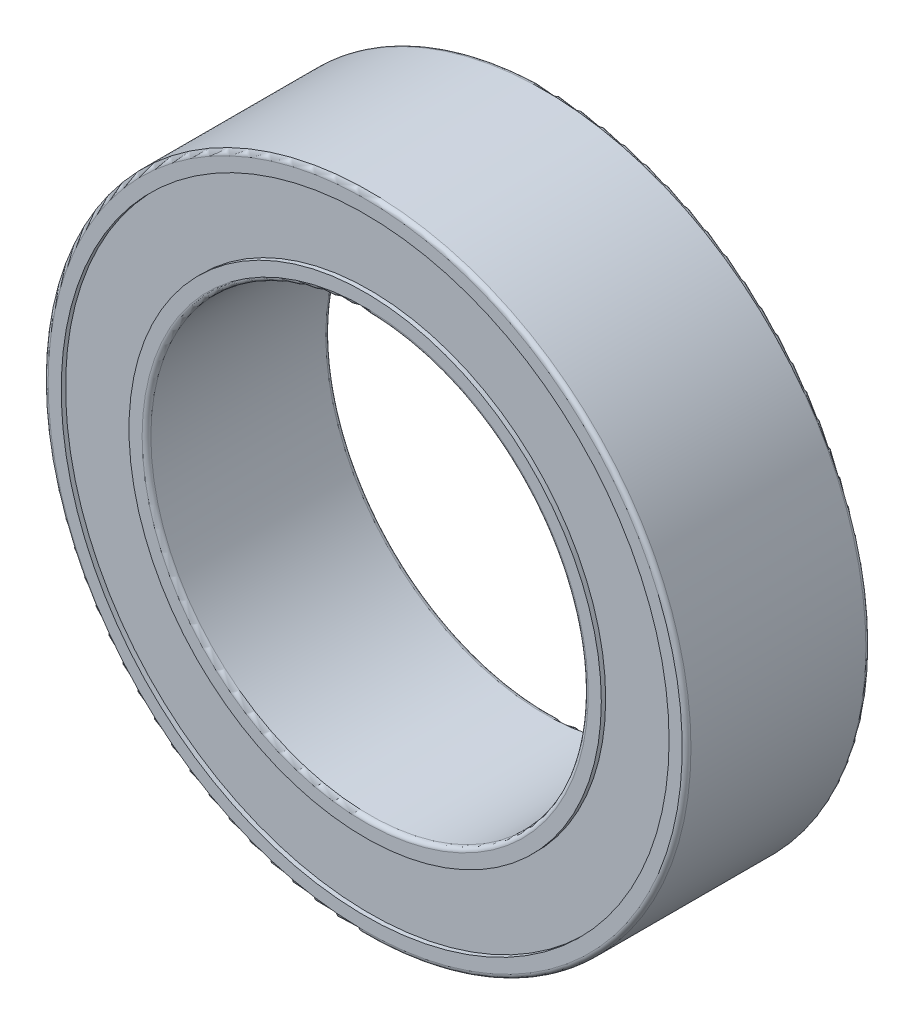
ISO-10303-21;
HEADER;
FILE_DESCRIPTION(('STEP AP214'),'2;1');
FILE_NAME('part.step','',(''),(''),'','','');
FILE_SCHEMA(('AUTOMOTIVE_DESIGN { 1 0 10303 214 1 1 1 1 }'));
ENDSEC;
DATA;
#1=APPLICATION_CONTEXT('core data for automotive mechanical design processes');
#2=APPLICATION_PROTOCOL_DEFINITION('international standard','automotive_design',2000,#1);
#3=PRODUCT_CONTEXT('',#1,'mechanical');
#4=PRODUCT('Part','Part','',(#3));
#5=PRODUCT_RELATED_PRODUCT_CATEGORY('part','',(#4));
#6=PRODUCT_DEFINITION_FORMATION('','',#4);
#7=PRODUCT_DEFINITION_CONTEXT('part definition',#1,'design');
#8=PRODUCT_DEFINITION('design','',#6,#7);
#9=PRODUCT_DEFINITION_SHAPE('','',#8);
#10=(LENGTH_UNIT() NAMED_UNIT(*) SI_UNIT(.MILLI.,.METRE.));
#11=(NAMED_UNIT(*) PLANE_ANGLE_UNIT() SI_UNIT($,.RADIAN.));
#12=(NAMED_UNIT(*) SI_UNIT($,.STERADIAN.) SOLID_ANGLE_UNIT());
#13=UNCERTAINTY_MEASURE_WITH_UNIT(LENGTH_MEASURE(1.E-05),#10,'distance_accuracy_value','');
#14=(GEOMETRIC_REPRESENTATION_CONTEXT(3) GLOBAL_UNCERTAINTY_ASSIGNED_CONTEXT((#13)) GLOBAL_UNIT_ASSIGNED_CONTEXT((#10,
#11,#12)) REPRESENTATION_CONTEXT('',''));
#15=CARTESIAN_POINT('',(0.,0.,0.));
#16=DIRECTION('',(0.,0.,1.));
#17=DIRECTION('',(1.,0.,0.));
#18=AXIS2_PLACEMENT_3D('',#15,#16,#17);
#19=CARTESIAN_POINT('',(0.,0.,14.88));
#20=DIRECTION('',(0.,0.,1.));
#21=DIRECTION('',(1.,0.,0.));
#22=AXIS2_PLACEMENT_3D('',#19,#20,#21);
#23=CYLINDRICAL_SURFACE('',#22,5.);
#24=CARTESIAN_POINT('',(0.,0.,2.));
#25=DIRECTION('',(0.,0.,-1.));
#26=DIRECTION('',(-1.,0.,0.));
#27=AXIS2_PLACEMENT_3D('',#24,#25,#26);
#28=CIRCLE('',#27,5.);
#29=CARTESIAN_POINT('',(-5.,0.,2.));
#30=VERTEX_POINT('',#29);
#31=EDGE_CURVE('E62',#30,#30,#28,.F.);
#32=ORIENTED_EDGE('',*,*,#31,.T.);
#33=EDGE_LOOP('',(#32));
#34=FACE_BOUND('',#33,.T.);
#35=CARTESIAN_POINT('',(0.,0.,-2.));
#36=DIRECTION('',(0.,0.,1.));
#37=DIRECTION('',(1.,0.,0.));
#38=AXIS2_PLACEMENT_3D('',#35,#36,#37);
#39=CIRCLE('',#38,5.);
#40=CARTESIAN_POINT('',(5.,0.,-2.));
#41=VERTEX_POINT('',#40);
#42=EDGE_CURVE('E65',#41,#41,#39,.F.);
#43=ORIENTED_EDGE('',*,*,#42,.T.);
#44=EDGE_LOOP('',(#43));
#45=FACE_BOUND('',#44,.T.);
#46=ADVANCED_FACE('F36',(#34,#45),#23,.F.);
#47=CARTESIAN_POINT('',(0.,5.,-2.1));
#48=DIRECTION('',(0.,0.,1.));
#49=DIRECTION('',(1.,0.,0.));
#50=AXIS2_PLACEMENT_3D('',#47,#48,#49);
#51=PLANE('',#50);
#52=CARTESIAN_POINT('',(0.,0.,-2.1));
#53=DIRECTION('',(0.,0.,1.));
#54=DIRECTION('',(1.,0.,0.));
#55=AXIS2_PLACEMENT_3D('',#52,#53,#54);
#56=CIRCLE('',#55,5.1);
#57=CARTESIAN_POINT('',(5.1,0.,-2.1));
#58=VERTEX_POINT('',#57);
#59=EDGE_CURVE('E56',#58,#58,#56,.T.);
#60=ORIENTED_EDGE('',*,*,#59,.T.);
#61=EDGE_LOOP('',(#60));
#62=FACE_BOUND('',#61,.T.);
#63=CARTESIAN_POINT('',(0.,0.,-2.1));
#64=DIRECTION('',(0.,0.,1.));
#65=DIRECTION('',(1.,0.,0.));
#66=AXIS2_PLACEMENT_3D('',#63,#64,#65);
#67=CIRCLE('',#66,5.4);
#68=CARTESIAN_POINT('',(5.4,0.,-2.1));
#69=VERTEX_POINT('',#68);
#70=EDGE_CURVE('E68',#69,#69,#67,.T.);
#71=ORIENTED_EDGE('',*,*,#70,.F.);
#72=EDGE_LOOP('',(#71));
#73=FACE_BOUND('',#72,.T.);
#74=ADVANCED_FACE('F124',(#62,#73),#51,.F.);
#75=CARTESIAN_POINT('',(0.,0.,14.88));
#76=DIRECTION('',(0.,0.,1.));
#77=DIRECTION('',(1.,0.,0.));
#78=AXIS2_PLACEMENT_3D('',#75,#76,#77);
#79=CYLINDRICAL_SURFACE('',#78,5.4);
#80=CARTESIAN_POINT('',(0.,0.,-2.));
#81=DIRECTION('',(0.,0.,1.));
#82=DIRECTION('',(1.,0.,0.));
#83=AXIS2_PLACEMENT_3D('',#80,#81,#82);
#84=CIRCLE('',#83,5.4);
#85=CARTESIAN_POINT('',(5.4,0.,-2.));
#86=VERTEX_POINT('',#85);
#87=EDGE_CURVE('E71',#86,#86,#84,.T.);
#88=ORIENTED_EDGE('',*,*,#87,.F.);
#89=EDGE_LOOP('',(#88));
#90=FACE_BOUND('',#89,.T.);
#91=ORIENTED_EDGE('',*,*,#70,.T.);
#92=EDGE_LOOP('',(#91));
#93=FACE_BOUND('',#92,.T.);
#94=ADVANCED_FACE('F130',(#90,#93),#79,.T.);
#95=CARTESIAN_POINT('',(0.,5.4,-2.));
#96=DIRECTION('',(0.,0.,1.));
#97=DIRECTION('',(1.,0.,0.));
#98=AXIS2_PLACEMENT_3D('',#95,#96,#97);
#99=PLANE('',#98);
#100=CARTESIAN_POINT('',(0.,0.,-2.));
#101=DIRECTION('',(0.,0.,1.));
#102=DIRECTION('',(1.,0.,0.));
#103=AXIS2_PLACEMENT_3D('',#100,#101,#102);
#104=CIRCLE('',#103,6.95);
#105=CARTESIAN_POINT('',(6.95,0.,-2.));
#106=VERTEX_POINT('',#105);
#107=EDGE_CURVE('E74',#106,#106,#104,.T.);
#108=ORIENTED_EDGE('',*,*,#107,.F.);
#109=EDGE_LOOP('',(#108));
#110=FACE_BOUND('',#109,.T.);
#111=ORIENTED_EDGE('',*,*,#87,.T.);
#112=EDGE_LOOP('',(#111));
#113=FACE_BOUND('',#112,.T.);
#114=ADVANCED_FACE('F255',(#110,#113),#99,.F.);
#115=CARTESIAN_POINT('',(0.,0.,14.88));
#116=DIRECTION('',(0.,0.,1.));
#117=DIRECTION('',(1.,0.,0.));
#118=AXIS2_PLACEMENT_3D('',#115,#116,#117);
#119=CYLINDRICAL_SURFACE('',#118,6.95);
#120=CARTESIAN_POINT('',(0.,0.,-2.1));
#121=DIRECTION('',(0.,0.,1.));
#122=DIRECTION('',(1.,0.,0.));
#123=AXIS2_PLACEMENT_3D('',#120,#121,#122);
#124=CIRCLE('',#123,6.95);
#125=CARTESIAN_POINT('',(6.95,0.,-2.1));
#126=VERTEX_POINT('',#125);
#127=EDGE_CURVE('E77',#126,#126,#124,.T.);
#128=ORIENTED_EDGE('',*,*,#127,.F.);
#129=EDGE_LOOP('',(#128));
#130=FACE_BOUND('',#129,.T.);
#131=ORIENTED_EDGE('',*,*,#107,.T.);
#132=EDGE_LOOP('',(#131));
#133=FACE_BOUND('',#132,.T.);
#134=ADVANCED_FACE('F210',(#130,#133),#119,.F.);
#135=CARTESIAN_POINT('',(0.,6.95,-2.1));
#136=DIRECTION('',(0.,0.,1.));
#137=DIRECTION('',(1.,0.,0.));
#138=AXIS2_PLACEMENT_3D('',#135,#136,#137);
#139=PLANE('',#138);
#140=CARTESIAN_POINT('',(0.,0.,-2.1));
#141=DIRECTION('',(0.,0.,1.));
#142=DIRECTION('',(1.,0.,0.));
#143=AXIS2_PLACEMENT_3D('',#140,#141,#142);
#144=CIRCLE('',#143,7.25);
#145=CARTESIAN_POINT('',(7.25,0.,-2.1));
#146=VERTEX_POINT('',#145);
#147=EDGE_CURVE('E43',#146,#146,#144,.F.);
#148=ORIENTED_EDGE('',*,*,#147,.T.);
#149=EDGE_LOOP('',(#148));
#150=FACE_BOUND('',#149,.T.);
#151=ORIENTED_EDGE('',*,*,#127,.T.);
#152=EDGE_LOOP('',(#151));
#153=FACE_BOUND('',#152,.T.);
#154=ADVANCED_FACE('F120',(#150,#153),#139,.F.);
#155=CARTESIAN_POINT('',(0.,0.,14.88));
#156=DIRECTION('',(0.,0.,1.));
#157=DIRECTION('',(1.,0.,0.));
#158=AXIS2_PLACEMENT_3D('',#155,#156,#157);
#159=CYLINDRICAL_SURFACE('',#158,7.35);
#160=CARTESIAN_POINT('',(0.,0.,-2.));
#161=DIRECTION('',(0.,0.,1.));
#162=DIRECTION('',(1.,0.,0.));
#163=AXIS2_PLACEMENT_3D('',#160,#161,#162);
#164=CIRCLE('',#163,7.35);
#165=CARTESIAN_POINT('',(7.35,0.,-2.));
#166=VERTEX_POINT('',#165);
#167=EDGE_CURVE('E47',#166,#166,#164,.T.);
#168=ORIENTED_EDGE('',*,*,#167,.T.);
#169=EDGE_LOOP('',(#168));
#170=FACE_BOUND('',#169,.T.);
#171=CARTESIAN_POINT('',(0.,0.,2.));
#172=DIRECTION('',(0.,0.,-1.));
#173=DIRECTION('',(-1.,0.,0.));
#174=AXIS2_PLACEMENT_3D('',#171,#172,#173);
#175=CIRCLE('',#174,7.35);
#176=CARTESIAN_POINT('',(-7.35,0.,2.));
#177=VERTEX_POINT('',#176);
#178=EDGE_CURVE('E51',#177,#177,#175,.T.);
#179=ORIENTED_EDGE('',*,*,#178,.T.);
#180=EDGE_LOOP('',(#179));
#181=FACE_BOUND('',#180,.T.);
#182=ADVANCED_FACE('F115',(#170,#181),#159,.T.);
#183=CARTESIAN_POINT('',(0.,6.95,2.1));
#184=DIRECTION('',(0.,0.,-1.));
#185=DIRECTION('',(-1.,0.,0.));
#186=AXIS2_PLACEMENT_3D('',#183,#184,#185);
#187=PLANE('',#186);
#188=CARTESIAN_POINT('',(0.,0.,2.1));
#189=DIRECTION('',(0.,0.,-1.));
#190=DIRECTION('',(-1.,0.,0.));
#191=AXIS2_PLACEMENT_3D('',#188,#189,#190);
#192=CIRCLE('',#191,7.25);
#193=CARTESIAN_POINT('',(-7.25,0.,2.1));
#194=VERTEX_POINT('',#193);
#195=EDGE_CURVE('E10',#194,#194,#192,.F.);
#196=ORIENTED_EDGE('',*,*,#195,.T.);
#197=EDGE_LOOP('',(#196));
#198=FACE_BOUND('',#197,.T.);
#199=CARTESIAN_POINT('',(0.,0.,2.1));
#200=DIRECTION('',(0.,0.,1.));
#201=DIRECTION('',(1.,0.,0.));
#202=AXIS2_PLACEMENT_3D('',#199,#200,#201);
#203=CIRCLE('',#202,6.95);
#204=CARTESIAN_POINT('',(6.95,0.,2.1));
#205=VERTEX_POINT('',#204);
#206=EDGE_CURVE('E80',#205,#205,#203,.T.);
#207=ORIENTED_EDGE('',*,*,#206,.F.);
#208=EDGE_LOOP('',(#207));
#209=FACE_BOUND('',#208,.T.);
#210=ADVANCED_FACE('F110',(#198,#209),#187,.F.);
#211=CARTESIAN_POINT('',(0.,0.,14.88));
#212=DIRECTION('',(0.,0.,1.));
#213=DIRECTION('',(1.,0.,0.));
#214=AXIS2_PLACEMENT_3D('',#211,#212,#213);
#215=CYLINDRICAL_SURFACE('',#214,6.95);
#216=CARTESIAN_POINT('',(0.,0.,2.));
#217=DIRECTION('',(0.,0.,1.));
#218=DIRECTION('',(1.,0.,0.));
#219=AXIS2_PLACEMENT_3D('',#216,#217,#218);
#220=CIRCLE('',#219,6.95);
#221=CARTESIAN_POINT('',(6.95,0.,2.));
#222=VERTEX_POINT('',#221);
#223=EDGE_CURVE('E83',#222,#222,#220,.T.);
#224=ORIENTED_EDGE('',*,*,#223,.F.);
#225=EDGE_LOOP('',(#224));
#226=FACE_BOUND('',#225,.T.);
#227=ORIENTED_EDGE('',*,*,#206,.T.);
#228=EDGE_LOOP('',(#227));
#229=FACE_BOUND('',#228,.T.);
#230=ADVANCED_FACE('F104',(#226,#229),#215,.F.);
#231=CARTESIAN_POINT('',(0.,5.4,2.));
#232=DIRECTION('',(0.,0.,-1.));
#233=DIRECTION('',(-1.,0.,0.));
#234=AXIS2_PLACEMENT_3D('',#231,#232,#233);
#235=PLANE('',#234);
#236=CARTESIAN_POINT('',(0.,0.,2.));
#237=DIRECTION('',(0.,0.,1.));
#238=DIRECTION('',(1.,0.,0.));
#239=AXIS2_PLACEMENT_3D('',#236,#237,#238);
#240=CIRCLE('',#239,5.4);
#241=CARTESIAN_POINT('',(5.4,0.,2.));
#242=VERTEX_POINT('',#241);
#243=EDGE_CURVE('E86',#242,#242,#240,.T.);
#244=ORIENTED_EDGE('',*,*,#243,.F.);
#245=EDGE_LOOP('',(#244));
#246=FACE_BOUND('',#245,.T.);
#247=ORIENTED_EDGE('',*,*,#223,.T.);
#248=EDGE_LOOP('',(#247));
#249=FACE_BOUND('',#248,.T.);
#250=ADVANCED_FACE('F98',(#246,#249),#235,.F.);
#251=CARTESIAN_POINT('',(0.,0.,14.88));
#252=DIRECTION('',(0.,0.,1.));
#253=DIRECTION('',(1.,0.,0.));
#254=AXIS2_PLACEMENT_3D('',#251,#252,#253);
#255=CYLINDRICAL_SURFACE('',#254,5.4);
#256=CARTESIAN_POINT('',(0.,0.,2.1));
#257=DIRECTION('',(0.,0.,1.));
#258=DIRECTION('',(1.,0.,0.));
#259=AXIS2_PLACEMENT_3D('',#256,#257,#258);
#260=CIRCLE('',#259,5.4);
#261=CARTESIAN_POINT('',(5.4,0.,2.1));
#262=VERTEX_POINT('',#261);
#263=EDGE_CURVE('E89',#262,#262,#260,.T.);
#264=ORIENTED_EDGE('',*,*,#263,.F.);
#265=EDGE_LOOP('',(#264));
#266=FACE_BOUND('',#265,.T.);
#267=ORIENTED_EDGE('',*,*,#243,.T.);
#268=EDGE_LOOP('',(#267));
#269=FACE_BOUND('',#268,.T.);
#270=ADVANCED_FACE('F95',(#266,#269),#255,.T.);
#271=CARTESIAN_POINT('',(0.,5.,2.1));
#272=DIRECTION('',(0.,0.,-1.));
#273=DIRECTION('',(-1.,0.,0.));
#274=AXIS2_PLACEMENT_3D('',#271,#272,#273);
#275=PLANE('',#274);
#276=CARTESIAN_POINT('',(0.,0.,2.1));
#277=DIRECTION('',(0.,0.,-1.));
#278=DIRECTION('',(-1.,0.,0.));
#279=AXIS2_PLACEMENT_3D('',#276,#277,#278);
#280=CIRCLE('',#279,5.1);
#281=CARTESIAN_POINT('',(-5.1,0.,2.1));
#282=VERTEX_POINT('',#281);
#283=EDGE_CURVE('E59',#282,#282,#280,.T.);
#284=ORIENTED_EDGE('',*,*,#283,.T.);
#285=EDGE_LOOP('',(#284));
#286=FACE_BOUND('',#285,.T.);
#287=ORIENTED_EDGE('',*,*,#263,.T.);
#288=EDGE_LOOP('',(#287));
#289=FACE_BOUND('',#288,.T.);
#290=ADVANCED_FACE('F93',(#286,#289),#275,.F.);
#291=CARTESIAN_POINT('',(0.,0.,2.));
#292=DIRECTION('',(0.,0.,-1.));
#293=DIRECTION('',(-1.,0.,0.));
#294=AXIS2_PLACEMENT_3D('',#291,#292,#293);
#295=TOROIDAL_SURFACE('',#294,5.1,0.1);
#296=ORIENTED_EDGE('',*,*,#283,.F.);
#297=EDGE_LOOP('',(#296));
#298=FACE_BOUND('',#297,.T.);
#299=ORIENTED_EDGE('',*,*,#31,.F.);
#300=EDGE_LOOP('',(#299));
#301=FACE_BOUND('',#300,.T.);
#302=ADVANCED_FACE('F136',(#298,#301),#295,.T.);
#303=CARTESIAN_POINT('',(0.,0.,-2.));
#304=DIRECTION('',(0.,0.,1.));
#305=DIRECTION('',(1.,0.,0.));
#306=AXIS2_PLACEMENT_3D('',#303,#304,#305);
#307=TOROIDAL_SURFACE('',#306,5.1,0.1);
#308=ORIENTED_EDGE('',*,*,#42,.F.);
#309=EDGE_LOOP('',(#308));
#310=FACE_BOUND('',#309,.T.);
#311=ORIENTED_EDGE('',*,*,#59,.F.);
#312=EDGE_LOOP('',(#311));
#313=FACE_BOUND('',#312,.T.);
#314=ADVANCED_FACE('F139',(#310,#313),#307,.T.);
#315=CARTESIAN_POINT('',(0.,0.,-2.));
#316=DIRECTION('',(0.,0.,1.));
#317=DIRECTION('',(1.,0.,0.));
#318=AXIS2_PLACEMENT_3D('',#315,#316,#317);
#319=TOROIDAL_SURFACE('',#318,7.25,0.1);
#320=ORIENTED_EDGE('',*,*,#147,.F.);
#321=EDGE_LOOP('',(#320));
#322=FACE_BOUND('',#321,.T.);
#323=ORIENTED_EDGE('',*,*,#167,.F.);
#324=EDGE_LOOP('',(#323));
#325=FACE_BOUND('',#324,.T.);
#326=ADVANCED_FACE('F142',(#322,#325),#319,.T.);
#327=CARTESIAN_POINT('',(0.,0.,2.));
#328=DIRECTION('',(0.,0.,-1.));
#329=DIRECTION('',(-1.,0.,0.));
#330=AXIS2_PLACEMENT_3D('',#327,#328,#329);
#331=TOROIDAL_SURFACE('',#330,7.25,0.1);
#332=ORIENTED_EDGE('',*,*,#178,.F.);
#333=EDGE_LOOP('',(#332));
#334=FACE_BOUND('',#333,.T.);
#335=ORIENTED_EDGE('',*,*,#195,.F.);
#336=EDGE_LOOP('',(#335));
#337=FACE_BOUND('',#336,.T.);
#338=ADVANCED_FACE('F38',(#334,#337),#331,.T.);
#339=CLOSED_SHELL('',(#46,#74,#94,#114,#134,#154,#182,#210,#230,#250,#270,#290,#302,#314,#326,#338));
#340=MANIFOLD_SOLID_BREP('B2',#339);
#341=ADVANCED_BREP_SHAPE_REPRESENTATION('',(#18,#340),#14);
#342=SHAPE_DEFINITION_REPRESENTATION(#9,#341);
ENDSEC;
END-ISO-10303-21;
